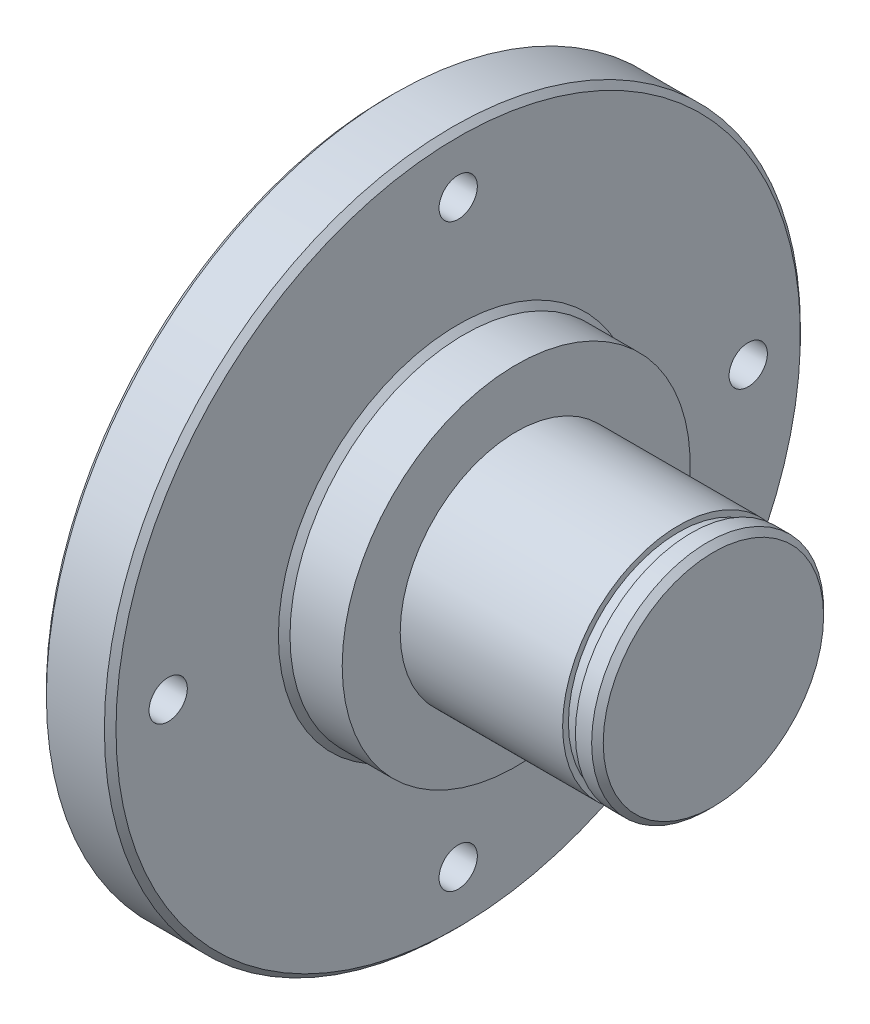
ISO-10303-21;
HEADER;
FILE_DESCRIPTION(('STEP AP214'),'2;1');
FILE_NAME('part.step','',(''),(''),'','','');
FILE_SCHEMA(('AUTOMOTIVE_DESIGN { 1 0 10303 214 1 1 1 1 }'));
ENDSEC;
DATA;
#1=APPLICATION_CONTEXT('core data for automotive mechanical design processes');
#2=APPLICATION_PROTOCOL_DEFINITION('international standard','automotive_design',2000,#1);
#3=PRODUCT_CONTEXT('',#1,'mechanical');
#4=PRODUCT('Part','Part','',(#3));
#5=PRODUCT_RELATED_PRODUCT_CATEGORY('part','',(#4));
#6=PRODUCT_DEFINITION_FORMATION('','',#4);
#7=PRODUCT_DEFINITION_CONTEXT('part definition',#1,'design');
#8=PRODUCT_DEFINITION('design','',#6,#7);
#9=PRODUCT_DEFINITION_SHAPE('','',#8);
#10=(LENGTH_UNIT() NAMED_UNIT(*) SI_UNIT(.MILLI.,.METRE.));
#11=(NAMED_UNIT(*) PLANE_ANGLE_UNIT() SI_UNIT($,.RADIAN.));
#12=(NAMED_UNIT(*) SI_UNIT($,.STERADIAN.) SOLID_ANGLE_UNIT());
#13=UNCERTAINTY_MEASURE_WITH_UNIT(LENGTH_MEASURE(1.E-05),#10,'distance_accuracy_value','');
#14=(GEOMETRIC_REPRESENTATION_CONTEXT(3) GLOBAL_UNCERTAINTY_ASSIGNED_CONTEXT((#13)) GLOBAL_UNIT_ASSIGNED_CONTEXT((#10,
#11,#12)) REPRESENTATION_CONTEXT('',''));
#15=CARTESIAN_POINT('',(0.,0.,0.));
#16=DIRECTION('',(0.,0.,1.));
#17=DIRECTION('',(1.,0.,0.));
#18=AXIS2_PLACEMENT_3D('',#15,#16,#17);
#19=CARTESIAN_POINT('',(-37.7136882129278,0.,0.));
#20=DIRECTION('',(-1.,0.,0.));
#21=DIRECTION('',(0.,0.,1.));
#22=AXIS2_PLACEMENT_3D('',#19,#20,#21);
#23=CYLINDRICAL_SURFACE('',#22,10.);
#24=CARTESIAN_POINT('',(11.,0.,0.));
#25=DIRECTION('',(-1.,0.,0.));
#26=DIRECTION('',(0.,0.,1.));
#27=AXIS2_PLACEMENT_3D('',#24,#25,#26);
#28=CIRCLE('',#27,10.);
#29=CARTESIAN_POINT('',(11.,0.,10.));
#30=VERTEX_POINT('',#29);
#31=EDGE_CURVE('E103',#30,#30,#28,.T.);
#32=ORIENTED_EDGE('',*,*,#31,.F.);
#33=EDGE_LOOP('',(#32));
#34=FACE_BOUND('',#33,.T.);
#35=CARTESIAN_POINT('',(25.,0.,0.));
#36=DIRECTION('',(1.,0.,0.));
#37=DIRECTION('',(0.,0.,-1.));
#38=AXIS2_PLACEMENT_3D('',#35,#36,#37);
#39=CIRCLE('',#38,10.);
#40=CARTESIAN_POINT('',(25.,0.,-10.));
#41=VERTEX_POINT('',#40);
#42=EDGE_CURVE('E58',#41,#41,#39,.T.);
#43=ORIENTED_EDGE('',*,*,#42,.F.);
#44=EDGE_LOOP('',(#43));
#45=FACE_BOUND('',#44,.T.);
#46=ADVANCED_FACE('F38',(#34,#45),#23,.T.);
#47=CARTESIAN_POINT('',(0.,0.,0.));
#48=DIRECTION('',(1.,0.,0.));
#49=DIRECTION('',(0.,0.,-1.));
#50=AXIS2_PLACEMENT_3D('',#47,#48,#49);
#51=PLANE('',#50);
#52=CARTESIAN_POINT('',(0.,0.,0.));
#53=DIRECTION('',(1.,0.,0.));
#54=DIRECTION('',(0.,0.,-1.));
#55=AXIS2_PLACEMENT_3D('',#52,#53,#54);
#56=CIRCLE('',#55,29.5);
#57=CARTESIAN_POINT('',(0.,0.,-29.5));
#58=VERTEX_POINT('',#57);
#59=EDGE_CURVE('E10',#58,#58,#56,.F.);
#60=ORIENTED_EDGE('',*,*,#59,.T.);
#61=EDGE_LOOP('',(#60));
#62=FACE_BOUND('',#61,.T.);
#63=CARTESIAN_POINT('',(0.,0.,-25.));
#64=DIRECTION('',(-1.,0.,0.));
#65=DIRECTION('',(0.,0.,1.));
#66=AXIS2_PLACEMENT_3D('',#63,#64,#65);
#67=CIRCLE('',#66,1.64999999999999);
#68=CARTESIAN_POINT('',(0.,0.,-23.35));
#69=VERTEX_POINT('',#68);
#70=EDGE_CURVE('E67',#69,#69,#67,.T.);
#71=ORIENTED_EDGE('',*,*,#70,.F.);
#72=EDGE_LOOP('',(#71));
#73=FACE_BOUND('',#72,.T.);
#74=CARTESIAN_POINT('',(0.,25.,0.));
#75=DIRECTION('',(-1.,0.,0.));
#76=DIRECTION('',(0.,0.,1.));
#77=AXIS2_PLACEMENT_3D('',#74,#75,#76);
#78=CIRCLE('',#77,1.64999999999999);
#79=CARTESIAN_POINT('',(0.,25.,1.64999999999999));
#80=VERTEX_POINT('',#79);
#81=EDGE_CURVE('E82',#80,#80,#78,.T.);
#82=ORIENTED_EDGE('',*,*,#81,.F.);
#83=EDGE_LOOP('',(#82));
#84=FACE_BOUND('',#83,.T.);
#85=CARTESIAN_POINT('',(0.,0.,25.));
#86=DIRECTION('',(-1.,0.,0.));
#87=DIRECTION('',(0.,0.,1.));
#88=AXIS2_PLACEMENT_3D('',#85,#86,#87);
#89=CIRCLE('',#88,1.64999999999999);
#90=CARTESIAN_POINT('',(0.,0.,26.65));
#91=VERTEX_POINT('',#90);
#92=EDGE_CURVE('E90',#91,#91,#89,.T.);
#93=ORIENTED_EDGE('',*,*,#92,.F.);
#94=EDGE_LOOP('',(#93));
#95=FACE_BOUND('',#94,.T.);
#96=CARTESIAN_POINT('',(0.,-25.,0.));
#97=DIRECTION('',(-1.,0.,0.));
#98=DIRECTION('',(0.,0.,1.));
#99=AXIS2_PLACEMENT_3D('',#96,#97,#98);
#100=CIRCLE('',#99,1.64999999999999);
#101=CARTESIAN_POINT('',(0.,-25.,1.64999999999999));
#102=VERTEX_POINT('',#101);
#103=EDGE_CURVE('E95',#102,#102,#100,.T.);
#104=ORIENTED_EDGE('',*,*,#103,.F.);
#105=EDGE_LOOP('',(#104));
#106=FACE_BOUND('',#105,.T.);
#107=ADVANCED_FACE('F153',(#62,#73,#84,#95,#106),#51,.F.);
#108=CARTESIAN_POINT('',(-37.7136882129278,0.,0.));
#109=DIRECTION('',(-1.,0.,0.));
#110=DIRECTION('',(0.,0.,1.));
#111=AXIS2_PLACEMENT_3D('',#108,#109,#110);
#112=CYLINDRICAL_SURFACE('',#111,30.);
#113=CARTESIAN_POINT('',(5.49999999999999,0.,0.));
#114=DIRECTION('',(-1.,0.,0.));
#115=DIRECTION('',(0.,0.,1.));
#116=AXIS2_PLACEMENT_3D('',#113,#114,#115);
#117=CIRCLE('',#116,30.);
#118=CARTESIAN_POINT('',(5.49999999999999,0.,30.));
#119=VERTEX_POINT('',#118);
#120=EDGE_CURVE('E47',#119,#119,#117,.T.);
#121=ORIENTED_EDGE('',*,*,#120,.T.);
#122=EDGE_LOOP('',(#121));
#123=FACE_BOUND('',#122,.T.);
#124=CARTESIAN_POINT('',(0.500000000000021,0.,0.));
#125=DIRECTION('',(1.,0.,0.));
#126=DIRECTION('',(0.,0.,-1.));
#127=AXIS2_PLACEMENT_3D('',#124,#125,#126);
#128=CIRCLE('',#127,30.);
#129=CARTESIAN_POINT('',(0.500000000000021,0.,-30.));
#130=VERTEX_POINT('',#129);
#131=EDGE_CURVE('E55',#130,#130,#128,.T.);
#132=ORIENTED_EDGE('',*,*,#131,.T.);
#133=EDGE_LOOP('',(#132));
#134=FACE_BOUND('',#133,.T.);
#135=ADVANCED_FACE('F137',(#123,#134),#112,.T.);
#136=CARTESIAN_POINT('',(6.,30.,0.));
#137=DIRECTION('',(-1.,0.,0.));
#138=DIRECTION('',(0.,0.,1.));
#139=AXIS2_PLACEMENT_3D('',#136,#137,#138);
#140=PLANE('',#139);
#141=CARTESIAN_POINT('',(6.,0.,0.));
#142=DIRECTION('',(-1.,0.,0.));
#143=DIRECTION('',(0.,0.,1.));
#144=AXIS2_PLACEMENT_3D('',#141,#142,#143);
#145=CIRCLE('',#144,15.5);
#146=CARTESIAN_POINT('',(6.,0.,15.5));
#147=VERTEX_POINT('',#146);
#148=EDGE_CURVE('E119',#147,#147,#145,.T.);
#149=ORIENTED_EDGE('',*,*,#148,.T.);
#150=EDGE_LOOP('',(#149));
#151=FACE_BOUND('',#150,.T.);
#152=CARTESIAN_POINT('',(6.,0.,0.));
#153=DIRECTION('',(-1.,0.,0.));
#154=DIRECTION('',(0.,0.,1.));
#155=AXIS2_PLACEMENT_3D('',#152,#153,#154);
#156=CIRCLE('',#155,29.5);
#157=CARTESIAN_POINT('',(6.,0.,29.5));
#158=VERTEX_POINT('',#157);
#159=EDGE_CURVE('E109',#158,#158,#156,.F.);
#160=ORIENTED_EDGE('',*,*,#159,.T.);
#161=EDGE_LOOP('',(#160));
#162=FACE_BOUND('',#161,.T.);
#163=CARTESIAN_POINT('',(6.,0.,-25.));
#164=DIRECTION('',(-1.,0.,0.));
#165=DIRECTION('',(0.,0.,1.));
#166=AXIS2_PLACEMENT_3D('',#163,#164,#165);
#167=CIRCLE('',#166,1.64999999999999);
#168=CARTESIAN_POINT('',(6.,0.,-23.35));
#169=VERTEX_POINT('',#168);
#170=EDGE_CURVE('E81',#169,#169,#167,.T.);
#171=ORIENTED_EDGE('',*,*,#170,.T.);
#172=EDGE_LOOP('',(#171));
#173=FACE_BOUND('',#172,.T.);
#174=CARTESIAN_POINT('',(6.,25.,0.));
#175=DIRECTION('',(-1.,0.,0.));
#176=DIRECTION('',(0.,0.,1.));
#177=AXIS2_PLACEMENT_3D('',#174,#175,#176);
#178=CIRCLE('',#177,1.64999999999999);
#179=CARTESIAN_POINT('',(6.,25.,1.64999999999999));
#180=VERTEX_POINT('',#179);
#181=EDGE_CURVE('E86',#180,#180,#178,.T.);
#182=ORIENTED_EDGE('',*,*,#181,.T.);
#183=EDGE_LOOP('',(#182));
#184=FACE_BOUND('',#183,.T.);
#185=CARTESIAN_POINT('',(6.,0.,25.));
#186=DIRECTION('',(-1.,0.,0.));
#187=DIRECTION('',(0.,0.,1.));
#188=AXIS2_PLACEMENT_3D('',#185,#186,#187);
#189=CIRCLE('',#188,1.64999999999999);
#190=CARTESIAN_POINT('',(6.,0.,26.65));
#191=VERTEX_POINT('',#190);
#192=EDGE_CURVE('E94',#191,#191,#189,.T.);
#193=ORIENTED_EDGE('',*,*,#192,.T.);
#194=EDGE_LOOP('',(#193));
#195=FACE_BOUND('',#194,.T.);
#196=CARTESIAN_POINT('',(6.,-25.,0.));
#197=DIRECTION('',(-1.,0.,0.));
#198=DIRECTION('',(0.,0.,1.));
#199=AXIS2_PLACEMENT_3D('',#196,#197,#198);
#200=CIRCLE('',#199,1.64999999999999);
#201=CARTESIAN_POINT('',(6.,-25.,1.64999999999999));
#202=VERTEX_POINT('',#201);
#203=EDGE_CURVE('E99',#202,#202,#200,.T.);
#204=ORIENTED_EDGE('',*,*,#203,.T.);
#205=EDGE_LOOP('',(#204));
#206=FACE_BOUND('',#205,.T.);
#207=ADVANCED_FACE('F192',(#151,#162,#173,#184,#195,#206),#140,.F.);
#208=CARTESIAN_POINT('',(-37.7136882129278,0.,0.));
#209=DIRECTION('',(-1.,0.,0.));
#210=DIRECTION('',(0.,0.,1.));
#211=AXIS2_PLACEMENT_3D('',#208,#209,#210);
#212=CYLINDRICAL_SURFACE('',#211,15.);
#213=CARTESIAN_POINT('',(6.5,0.,0.));
#214=DIRECTION('',(-1.,0.,0.));
#215=DIRECTION('',(0.,0.,1.));
#216=AXIS2_PLACEMENT_3D('',#213,#214,#215);
#217=CIRCLE('',#216,15.);
#218=CARTESIAN_POINT('',(6.5,0.,15.));
#219=VERTEX_POINT('',#218);
#220=EDGE_CURVE('E123',#219,#219,#217,.F.);
#221=ORIENTED_EDGE('',*,*,#220,.T.);
#222=EDGE_LOOP('',(#221));
#223=FACE_BOUND('',#222,.T.);
#224=CARTESIAN_POINT('',(11.,0.,0.));
#225=DIRECTION('',(-1.,0.,0.));
#226=DIRECTION('',(0.,0.,1.));
#227=AXIS2_PLACEMENT_3D('',#224,#225,#226);
#228=CIRCLE('',#227,15.);
#229=CARTESIAN_POINT('',(11.,0.,15.));
#230=VERTEX_POINT('',#229);
#231=EDGE_CURVE('E106',#230,#230,#228,.T.);
#232=ORIENTED_EDGE('',*,*,#231,.T.);
#233=EDGE_LOOP('',(#232));
#234=FACE_BOUND('',#233,.T.);
#235=ADVANCED_FACE('F196',(#223,#234),#212,.T.);
#236=CARTESIAN_POINT('',(11.,15.,0.));
#237=DIRECTION('',(-1.,0.,0.));
#238=DIRECTION('',(0.,0.,1.));
#239=AXIS2_PLACEMENT_3D('',#236,#237,#238);
#240=PLANE('',#239);
#241=ORIENTED_EDGE('',*,*,#231,.F.);
#242=EDGE_LOOP('',(#241));
#243=FACE_BOUND('',#242,.T.);
#244=ORIENTED_EDGE('',*,*,#31,.T.);
#245=EDGE_LOOP('',(#244));
#246=FACE_BOUND('',#245,.T.);
#247=ADVANCED_FACE('F199',(#243,#246),#240,.F.);
#248=CARTESIAN_POINT('',(0.,-25.,0.));
#249=DIRECTION('',(-1.,0.,0.));
#250=DIRECTION('',(0.,0.,1.));
#251=AXIS2_PLACEMENT_3D('',#248,#249,#250);
#252=CYLINDRICAL_SURFACE('',#251,1.64999999999999);
#253=ORIENTED_EDGE('',*,*,#103,.T.);
#254=EDGE_LOOP('',(#253));
#255=FACE_BOUND('',#254,.T.);
#256=ORIENTED_EDGE('',*,*,#203,.F.);
#257=EDGE_LOOP('',(#256));
#258=FACE_BOUND('',#257,.T.);
#259=ADVANCED_FACE('F202',(#255,#258),#252,.F.);
#260=CARTESIAN_POINT('',(0.,0.,25.));
#261=DIRECTION('',(-1.,0.,0.));
#262=DIRECTION('',(0.,0.,1.));
#263=AXIS2_PLACEMENT_3D('',#260,#261,#262);
#264=CYLINDRICAL_SURFACE('',#263,1.64999999999999);
#265=ORIENTED_EDGE('',*,*,#92,.T.);
#266=EDGE_LOOP('',(#265));
#267=FACE_BOUND('',#266,.T.);
#268=ORIENTED_EDGE('',*,*,#192,.F.);
#269=EDGE_LOOP('',(#268));
#270=FACE_BOUND('',#269,.T.);
#271=ADVANCED_FACE('F207',(#267,#270),#264,.F.);
#272=CARTESIAN_POINT('',(0.,25.,0.));
#273=DIRECTION('',(-1.,0.,0.));
#274=DIRECTION('',(0.,0.,1.));
#275=AXIS2_PLACEMENT_3D('',#272,#273,#274);
#276=CYLINDRICAL_SURFACE('',#275,1.64999999999999);
#277=ORIENTED_EDGE('',*,*,#81,.T.);
#278=EDGE_LOOP('',(#277));
#279=FACE_BOUND('',#278,.T.);
#280=ORIENTED_EDGE('',*,*,#181,.F.);
#281=EDGE_LOOP('',(#280));
#282=FACE_BOUND('',#281,.T.);
#283=ADVANCED_FACE('F216',(#279,#282),#276,.F.);
#284=CARTESIAN_POINT('',(0.,0.,-25.));
#285=DIRECTION('',(-1.,0.,0.));
#286=DIRECTION('',(0.,0.,1.));
#287=AXIS2_PLACEMENT_3D('',#284,#285,#286);
#288=CYLINDRICAL_SURFACE('',#287,1.64999999999999);
#289=ORIENTED_EDGE('',*,*,#70,.T.);
#290=EDGE_LOOP('',(#289));
#291=FACE_BOUND('',#290,.T.);
#292=ORIENTED_EDGE('',*,*,#170,.F.);
#293=EDGE_LOOP('',(#292));
#294=FACE_BOUND('',#293,.T.);
#295=ADVANCED_FACE('F187',(#291,#294),#288,.F.);
#296=CARTESIAN_POINT('',(6.,0.,0.));
#297=DIRECTION('',(-1.,0.,0.));
#298=DIRECTION('',(0.,0.,1.));
#299=AXIS2_PLACEMENT_3D('',#296,#297,#298);
#300=CONICAL_SURFACE('',#299,15.5,0.785398163397441);
#301=ORIENTED_EDGE('',*,*,#220,.F.);
#302=EDGE_LOOP('',(#301));
#303=FACE_BOUND('',#302,.T.);
#304=ORIENTED_EDGE('',*,*,#148,.F.);
#305=EDGE_LOOP('',(#304));
#306=FACE_BOUND('',#305,.T.);
#307=ADVANCED_FACE('F150',(#303,#306),#300,.T.);
#308=CARTESIAN_POINT('',(5.49999999999999,0.,0.));
#309=DIRECTION('',(-1.,0.,0.));
#310=DIRECTION('',(0.,0.,1.));
#311=AXIS2_PLACEMENT_3D('',#308,#309,#310);
#312=CONICAL_SURFACE('',#311,30.,0.785398163397452);
#313=ORIENTED_EDGE('',*,*,#159,.F.);
#314=EDGE_LOOP('',(#313));
#315=FACE_BOUND('',#314,.T.);
#316=ORIENTED_EDGE('',*,*,#120,.F.);
#317=EDGE_LOOP('',(#316));
#318=FACE_BOUND('',#317,.T.);
#319=ADVANCED_FACE('F142',(#315,#318),#312,.T.);
#320=CARTESIAN_POINT('',(0.,0.,0.));
#321=DIRECTION('',(1.,0.,0.));
#322=DIRECTION('',(0.,0.,-1.));
#323=AXIS2_PLACEMENT_3D('',#320,#321,#322);
#324=CONICAL_SURFACE('',#323,29.5,0.785398163397428);
#325=ORIENTED_EDGE('',*,*,#131,.F.);
#326=EDGE_LOOP('',(#325));
#327=FACE_BOUND('',#326,.T.);
#328=ORIENTED_EDGE('',*,*,#59,.F.);
#329=EDGE_LOOP('',(#328));
#330=FACE_BOUND('',#329,.T.);
#331=ADVANCED_FACE('F40',(#327,#330),#324,.T.);
#332=CARTESIAN_POINT('',(26.1,10.404012781308,0.));
#333=DIRECTION('',(-1.,0.,0.));
#334=DIRECTION('',(0.,0.,1.));
#335=AXIS2_PLACEMENT_3D('',#332,#333,#334);
#336=PLANE('',#335);
#337=CARTESIAN_POINT('',(26.1,0.,0.));
#338=DIRECTION('',(-1.,0.,0.));
#339=DIRECTION('',(0.,0.,1.));
#340=AXIS2_PLACEMENT_3D('',#337,#338,#339);
#341=CIRCLE('',#340,9.5);
#342=CARTESIAN_POINT('',(26.1,0.,9.5));
#343=VERTEX_POINT('',#342);
#344=EDGE_CURVE('E61',#343,#343,#341,.T.);
#345=ORIENTED_EDGE('',*,*,#344,.F.);
#346=EDGE_LOOP('',(#345));
#347=FACE_BOUND('',#346,.T.);
#348=CARTESIAN_POINT('',(26.1,0.,0.));
#349=DIRECTION('',(-1.,0.,0.));
#350=DIRECTION('',(0.,0.,1.));
#351=AXIS2_PLACEMENT_3D('',#348,#349,#350);
#352=CIRCLE('',#351,10.);
#353=CARTESIAN_POINT('',(26.1,0.,10.));
#354=VERTEX_POINT('',#353);
#355=EDGE_CURVE('E42',#354,#354,#352,.T.);
#356=ORIENTED_EDGE('',*,*,#355,.T.);
#357=EDGE_LOOP('',(#356));
#358=FACE_BOUND('',#357,.T.);
#359=ADVANCED_FACE('F141',(#347,#358),#336,.T.);
#360=CARTESIAN_POINT('',(25.,10.404012781308,0.));
#361=DIRECTION('',(1.,0.,0.));
#362=DIRECTION('',(0.,0.,-1.));
#363=AXIS2_PLACEMENT_3D('',#360,#361,#362);
#364=PLANE('',#363);
#365=CARTESIAN_POINT('',(25.,0.,0.));
#366=DIRECTION('',(-1.,0.,0.));
#367=DIRECTION('',(0.,0.,1.));
#368=AXIS2_PLACEMENT_3D('',#365,#366,#367);
#369=CIRCLE('',#368,9.5);
#370=CARTESIAN_POINT('',(25.,0.,9.5));
#371=VERTEX_POINT('',#370);
#372=EDGE_CURVE('E70',#371,#371,#369,.T.);
#373=ORIENTED_EDGE('',*,*,#372,.T.);
#374=EDGE_LOOP('',(#373));
#375=FACE_BOUND('',#374,.T.);
#376=ORIENTED_EDGE('',*,*,#42,.T.);
#377=EDGE_LOOP('',(#376));
#378=FACE_BOUND('',#377,.T.);
#379=ADVANCED_FACE('F147',(#375,#378),#364,.T.);
#380=CARTESIAN_POINT('',(-5.37347448822292,0.,0.));
#381=DIRECTION('',(-1.,0.,0.));
#382=DIRECTION('',(0.,0.,1.));
#383=AXIS2_PLACEMENT_3D('',#380,#381,#382);
#384=CYLINDRICAL_SURFACE('',#383,9.5);
#385=ORIENTED_EDGE('',*,*,#344,.T.);
#386=EDGE_LOOP('',(#385));
#387=FACE_BOUND('',#386,.T.);
#388=ORIENTED_EDGE('',*,*,#372,.F.);
#389=EDGE_LOOP('',(#388));
#390=FACE_BOUND('',#389,.T.);
#391=ADVANCED_FACE('F182',(#387,#390),#384,.T.);
#392=CARTESIAN_POINT('',(28.,10.,0.));
#393=DIRECTION('',(-1.,0.,0.));
#394=DIRECTION('',(0.,0.,1.));
#395=AXIS2_PLACEMENT_3D('',#392,#393,#394);
#396=PLANE('',#395);
#397=CARTESIAN_POINT('',(28.,0.,0.));
#398=DIRECTION('',(-1.,0.,0.));
#399=DIRECTION('',(0.,0.,1.));
#400=AXIS2_PLACEMENT_3D('',#397,#398,#399);
#401=CIRCLE('',#400,9.5);
#402=CARTESIAN_POINT('',(28.,0.,9.5));
#403=VERTEX_POINT('',#402);
#404=EDGE_CURVE('E130',#403,#403,#401,.F.);
#405=ORIENTED_EDGE('',*,*,#404,.T.);
#406=EDGE_LOOP('',(#405));
#407=FACE_BOUND('',#406,.T.);
#408=ADVANCED_FACE('F171',(#407),#396,.F.);
#409=CARTESIAN_POINT('',(27.5,0.,0.));
#410=DIRECTION('',(-1.,0.,0.));
#411=DIRECTION('',(0.,0.,1.));
#412=AXIS2_PLACEMENT_3D('',#409,#410,#411);
#413=CONICAL_SURFACE('',#412,10.,0.785398163397467);
#414=ORIENTED_EDGE('',*,*,#404,.F.);
#415=EDGE_LOOP('',(#414));
#416=FACE_BOUND('',#415,.T.);
#417=CARTESIAN_POINT('',(27.5,0.,0.));
#418=DIRECTION('',(-1.,0.,0.));
#419=DIRECTION('',(0.,0.,1.));
#420=AXIS2_PLACEMENT_3D('',#417,#418,#419);
#421=CIRCLE('',#420,10.);
#422=CARTESIAN_POINT('',(27.5,0.,10.));
#423=VERTEX_POINT('',#422);
#424=EDGE_CURVE('E127',#423,#423,#421,.T.);
#425=ORIENTED_EDGE('',*,*,#424,.F.);
#426=EDGE_LOOP('',(#425));
#427=FACE_BOUND('',#426,.T.);
#428=ADVANCED_FACE('F166',(#416,#427),#413,.T.);
#429=ORIENTED_EDGE('',*,*,#424,.T.);
#430=EDGE_LOOP('',(#429));
#431=FACE_BOUND('',#430,.T.);
#432=ORIENTED_EDGE('',*,*,#355,.F.);
#433=EDGE_LOOP('',(#432));
#434=FACE_BOUND('',#433,.T.);
#435=ADVANCED_FACE('F156',(#431,#434),#23,.T.);
#436=CLOSED_SHELL('',(#46,#107,#135,#207,#235,#247,#259,#271,#283,#295,#307,#319,#331,#359,#379,
#391,#408,#428,#435));
#437=MANIFOLD_SOLID_BREP('B2',#436);
#438=ADVANCED_BREP_SHAPE_REPRESENTATION('',(#18,#437),#14);
#439=SHAPE_DEFINITION_REPRESENTATION(#9,#438);
ENDSEC;
END-ISO-10303-21;
